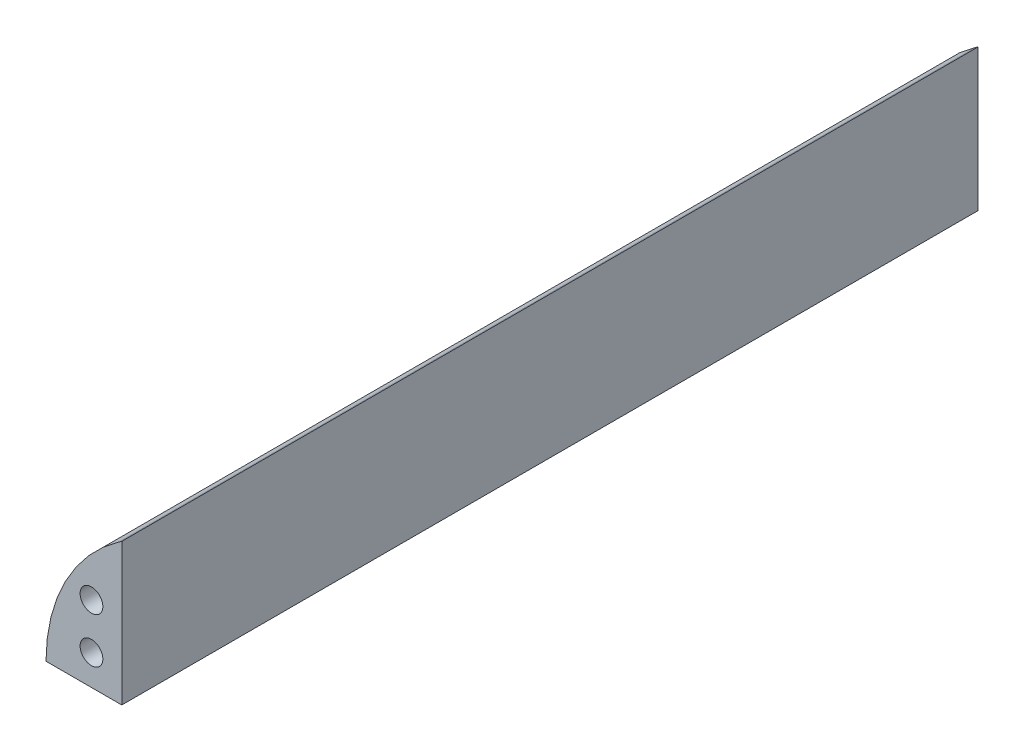
ISO-10303-21;
HEADER;
FILE_DESCRIPTION(('STEP AP214'),'2;1');
FILE_NAME('part.step','',(''),(''),'','','');
FILE_SCHEMA(('AUTOMOTIVE_DESIGN { 1 0 10303 214 1 1 1 1 }'));
ENDSEC;
DATA;
#1=APPLICATION_CONTEXT('core data for automotive mechanical design processes');
#2=APPLICATION_PROTOCOL_DEFINITION('international standard','automotive_design',2000,#1);
#3=PRODUCT_CONTEXT('',#1,'mechanical');
#4=PRODUCT('Part','Part','',(#3));
#5=PRODUCT_RELATED_PRODUCT_CATEGORY('part','',(#4));
#6=PRODUCT_DEFINITION_FORMATION('','',#4);
#7=PRODUCT_DEFINITION_CONTEXT('part definition',#1,'design');
#8=PRODUCT_DEFINITION('design','',#6,#7);
#9=PRODUCT_DEFINITION_SHAPE('','',#8);
#10=(LENGTH_UNIT() NAMED_UNIT(*) SI_UNIT(.MILLI.,.METRE.));
#11=(NAMED_UNIT(*) PLANE_ANGLE_UNIT() SI_UNIT($,.RADIAN.));
#12=(NAMED_UNIT(*) SI_UNIT($,.STERADIAN.) SOLID_ANGLE_UNIT());
#13=UNCERTAINTY_MEASURE_WITH_UNIT(LENGTH_MEASURE(1.E-05),#10,'distance_accuracy_value','');
#14=(GEOMETRIC_REPRESENTATION_CONTEXT(3) GLOBAL_UNCERTAINTY_ASSIGNED_CONTEXT((#13)) GLOBAL_UNIT_ASSIGNED_CONTEXT((#10,
#11,#12)) REPRESENTATION_CONTEXT('',''));
#15=CARTESIAN_POINT('',(0.,0.,0.));
#16=DIRECTION('',(0.,0.,1.));
#17=DIRECTION('',(1.,0.,0.));
#18=AXIS2_PLACEMENT_3D('',#15,#16,#17);
#19=CARTESIAN_POINT('',(11.5,30.9793370944993,113.));
#20=DIRECTION('',(0.,1.,0.));
#21=DIRECTION('',(-1.,0.,0.));
#22=AXIS2_PLACEMENT_3D('',#19,#20,#21);
#23=PLANE('',#22);
#24=DIRECTION('',(1.,0.,0.));
#25=VECTOR('',#24,1.);
#26=CARTESIAN_POINT('',(11.5,30.9793370944993,0.));
#27=LINE('',#26,#25);
#28=CARTESIAN_POINT('',(11.5,30.9793370944993,0.));
#29=VERTEX_POINT('',#28);
#30=CARTESIAN_POINT('',(21.5,30.9793370944993,0.));
#31=VERTEX_POINT('',#30);
#32=EDGE_CURVE('E149',#29,#31,#27,.T.);
#33=ORIENTED_EDGE('',*,*,#32,.T.);
#34=DIRECTION('',(0.,0.,-1.));
#35=VECTOR('',#34,1.);
#36=CARTESIAN_POINT('',(21.5,30.9793370944993,113.));
#37=LINE('',#36,#35);
#38=CARTESIAN_POINT('',(21.5,30.9793370944993,113.));
#39=VERTEX_POINT('',#38);
#40=EDGE_CURVE('E11',#39,#31,#37,.T.);
#41=ORIENTED_EDGE('',*,*,#40,.F.);
#42=DIRECTION('',(1.,0.,0.));
#43=VECTOR('',#42,1.);
#44=CARTESIAN_POINT('',(11.5,30.9793370944993,113.));
#45=LINE('',#44,#43);
#46=CARTESIAN_POINT('',(11.5,30.9793370944993,113.));
#47=VERTEX_POINT('',#46);
#48=EDGE_CURVE('E170',#47,#39,#45,.T.);
#49=ORIENTED_EDGE('',*,*,#48,.F.);
#50=DIRECTION('',(0.,0.,-1.));
#51=VECTOR('',#50,1.);
#52=CARTESIAN_POINT('',(11.5,30.9793370944993,113.));
#53=LINE('',#52,#51);
#54=EDGE_CURVE('E145',#47,#29,#53,.T.);
#55=ORIENTED_EDGE('',*,*,#54,.T.);
#56=EDGE_LOOP('',(#33,#41,#49,#55));
#57=FACE_BOUND('',#56,.T.);
#58=ADVANCED_FACE('F35',(#57),#23,.F.);
#59=CARTESIAN_POINT('',(21.5,30.9793370944993,113.));
#60=DIRECTION('',(-1.,0.,0.));
#61=DIRECTION('',(0.,0.,1.));
#62=AXIS2_PLACEMENT_3D('',#59,#60,#61);
#63=PLANE('',#62);
#64=DIRECTION('',(0.,1.,0.));
#65=VECTOR('',#64,1.);
#66=CARTESIAN_POINT('',(21.5,30.9793370944993,0.));
#67=LINE('',#66,#65);
#68=CARTESIAN_POINT('',(21.5,49.687624028369,0.));
#69=VERTEX_POINT('',#68);
#70=EDGE_CURVE('E152',#31,#69,#67,.T.);
#71=ORIENTED_EDGE('',*,*,#70,.T.);
#72=DIRECTION('',(0.,0.,-1.));
#73=VECTOR('',#72,1.);
#74=CARTESIAN_POINT('',(21.5,49.687624028369,113.));
#75=LINE('',#74,#73);
#76=CARTESIAN_POINT('',(21.5,49.687624028369,113.));
#77=VERTEX_POINT('',#76);
#78=EDGE_CURVE('E43',#77,#69,#75,.T.);
#79=ORIENTED_EDGE('',*,*,#78,.F.);
#80=DIRECTION('',(0.,1.,0.));
#81=VECTOR('',#80,1.);
#82=CARTESIAN_POINT('',(21.5,30.9793370944993,113.));
#83=LINE('',#82,#81);
#84=EDGE_CURVE('E103',#39,#77,#83,.T.);
#85=ORIENTED_EDGE('',*,*,#84,.F.);
#86=ORIENTED_EDGE('',*,*,#40,.T.);
#87=EDGE_LOOP('',(#71,#79,#85,#86));
#88=FACE_BOUND('',#87,.T.);
#89=ADVANCED_FACE('F243',(#88),#63,.F.);
#90=CARTESIAN_POINT('',(21.5,49.687624028369,113.));
#91=DIRECTION('',(0.56311095315379,-0.826381300876435,0.));
#92=DIRECTION('',(0.826381300876436,0.56311095315379,0.));
#93=AXIS2_PLACEMENT_3D('',#90,#91,#92);
#94=PLANE('',#93);
#95=DIRECTION('',(-0.826381300876435,-0.56311095315379,0.));
#96=VECTOR('',#95,1.);
#97=CARTESIAN_POINT('',(21.5,49.687624028369,0.));
#98=LINE('',#97,#96);
#99=CARTESIAN_POINT('',(21.1610596660596,49.456664041369,0.));
#100=VERTEX_POINT('',#99);
#101=EDGE_CURVE('E155',#69,#100,#98,.T.);
#102=ORIENTED_EDGE('',*,*,#101,.T.);
#103=DIRECTION('',(0.,0.,-1.));
#104=VECTOR('',#103,1.);
#105=CARTESIAN_POINT('',(21.1610596660596,49.456664041369,113.));
#106=LINE('',#105,#104);
#107=CARTESIAN_POINT('',(21.1610596660596,49.456664041369,113.));
#108=VERTEX_POINT('',#107);
#109=EDGE_CURVE('E186',#108,#100,#106,.T.);
#110=ORIENTED_EDGE('',*,*,#109,.F.);
#111=DIRECTION('',(-0.826381300876435,-0.56311095315379,0.));
#112=VECTOR('',#111,1.);
#113=CARTESIAN_POINT('',(21.5,49.687624028369,113.));
#114=LINE('',#113,#112);
#115=EDGE_CURVE('E194',#77,#108,#114,.T.);
#116=ORIENTED_EDGE('',*,*,#115,.F.);
#117=ORIENTED_EDGE('',*,*,#78,.T.);
#118=EDGE_LOOP('',(#102,#110,#116,#117));
#119=FACE_BOUND('',#118,.T.);
#120=ADVANCED_FACE('F192',(#119),#94,.F.);
#121=CARTESIAN_POINT('',(21.1610596660596,49.456664041369,113.));
#122=DIRECTION('',(0.618254008122195,-0.78597835939728,0.));
#123=DIRECTION('',(0.78597835939728,0.618254008122195,0.));
#124=AXIS2_PLACEMENT_3D('',#121,#122,#123);
#125=PLANE('',#124);
#126=DIRECTION('',(-0.78597835939728,-0.618254008122195,0.));
#127=VECTOR('',#126,1.);
#128=CARTESIAN_POINT('',(21.1610596660596,49.456664041369,0.));
#129=LINE('',#128,#127);
#130=CARTESIAN_POINT('',(19.0663453069363,47.8089525835215,0.));
#131=VERTEX_POINT('',#130);
#132=EDGE_CURVE('E157',#100,#131,#129,.T.);
#133=ORIENTED_EDGE('',*,*,#132,.T.);
#134=DIRECTION('',(0.,0.,-1.));
#135=VECTOR('',#134,1.);
#136=CARTESIAN_POINT('',(19.0663453069363,47.8089525835215,113.));
#137=LINE('',#136,#135);
#138=CARTESIAN_POINT('',(19.0663453069363,47.8089525835215,113.));
#139=VERTEX_POINT('',#138);
#140=EDGE_CURVE('E183',#139,#131,#137,.T.);
#141=ORIENTED_EDGE('',*,*,#140,.F.);
#142=DIRECTION('',(-0.78597835939728,-0.618254008122195,0.));
#143=VECTOR('',#142,1.);
#144=CARTESIAN_POINT('',(21.1610596660596,49.456664041369,113.));
#145=LINE('',#144,#143);
#146=EDGE_CURVE('E212',#108,#139,#145,.T.);
#147=ORIENTED_EDGE('',*,*,#146,.F.);
#148=ORIENTED_EDGE('',*,*,#109,.T.);
#149=EDGE_LOOP('',(#133,#141,#147,#148));
#150=FACE_BOUND('',#149,.T.);
#151=ADVANCED_FACE('F203',(#150),#125,.F.);
#152=CARTESIAN_POINT('',(19.0663453069363,47.8089525835215,113.));
#153=DIRECTION('',(0.707328887292362,-0.706884605294067,0.));
#154=DIRECTION('',(0.706884605294067,0.707328887292362,0.));
#155=AXIS2_PLACEMENT_3D('',#152,#153,#154);
#156=PLANE('',#155);
#157=DIRECTION('',(-0.706884605294067,-0.707328887292362,0.));
#158=VECTOR('',#157,1.);
#159=CARTESIAN_POINT('',(19.0663453069363,47.8089525835215,0.));
#160=LINE('',#159,#158);
#161=CARTESIAN_POINT('',(17.161004874362,45.902414630944,0.));
#162=VERTEX_POINT('',#161);
#163=EDGE_CURVE('E159',#131,#162,#160,.T.);
#164=ORIENTED_EDGE('',*,*,#163,.T.);
#165=DIRECTION('',(0.,0.,-1.));
#166=VECTOR('',#165,1.);
#167=CARTESIAN_POINT('',(17.161004874362,45.902414630944,113.));
#168=LINE('',#167,#166);
#169=CARTESIAN_POINT('',(17.161004874362,45.902414630944,113.));
#170=VERTEX_POINT('',#169);
#171=EDGE_CURVE('E180',#170,#162,#168,.T.);
#172=ORIENTED_EDGE('',*,*,#171,.F.);
#173=DIRECTION('',(-0.706884605294067,-0.707328887292362,0.));
#174=VECTOR('',#173,1.);
#175=CARTESIAN_POINT('',(19.0663453069363,47.8089525835215,113.));
#176=LINE('',#175,#174);
#177=EDGE_CURVE('E209',#139,#170,#176,.T.);
#178=ORIENTED_EDGE('',*,*,#177,.F.);
#179=ORIENTED_EDGE('',*,*,#140,.T.);
#180=EDGE_LOOP('',(#164,#172,#178,#179));
#181=FACE_BOUND('',#180,.T.);
#182=ADVANCED_FACE('F207',(#181),#156,.F.);
#183=CARTESIAN_POINT('',(17.161004874362,45.902414630944,113.));
#184=DIRECTION('',(0.787045273233736,-0.61689524060446,0.));
#185=DIRECTION('',(0.61689524060446,0.787045273233736,0.));
#186=AXIS2_PLACEMENT_3D('',#183,#184,#185);
#187=PLANE('',#186);
#188=DIRECTION('',(-0.61689524060446,-0.787045273233736,0.));
#189=VECTOR('',#188,1.);
#190=CARTESIAN_POINT('',(17.161004874362,45.902414630944,0.));
#191=LINE('',#190,#189);
#192=CARTESIAN_POINT('',(15.4864529995116,43.7659933212345,0.));
#193=VERTEX_POINT('',#192);
#194=EDGE_CURVE('E161',#162,#193,#191,.T.);
#195=ORIENTED_EDGE('',*,*,#194,.T.);
#196=DIRECTION('',(0.,0.,-1.));
#197=VECTOR('',#196,1.);
#198=CARTESIAN_POINT('',(15.4864529995116,43.7659933212345,113.));
#199=LINE('',#198,#197);
#200=CARTESIAN_POINT('',(15.4864529995116,43.7659933212345,113.));
#201=VERTEX_POINT('',#200);
#202=EDGE_CURVE('E177',#201,#193,#199,.T.);
#203=ORIENTED_EDGE('',*,*,#202,.F.);
#204=DIRECTION('',(-0.61689524060446,-0.787045273233736,0.));
#205=VECTOR('',#204,1.);
#206=CARTESIAN_POINT('',(17.161004874362,45.902414630944,113.));
#207=LINE('',#206,#205);
#208=EDGE_CURVE('E211',#170,#201,#207,.T.);
#209=ORIENTED_EDGE('',*,*,#208,.F.);
#210=ORIENTED_EDGE('',*,*,#171,.T.);
#211=EDGE_LOOP('',(#195,#203,#209,#210));
#212=FACE_BOUND('',#211,.T.);
#213=ADVANCED_FACE('F256',(#212),#187,.F.);
#214=CARTESIAN_POINT('',(15.4864529995116,43.7659933212345,113.));
#215=DIRECTION('',(0.855766354330929,-0.517362490711446,0.));
#216=DIRECTION('',(0.517362490711446,0.855766354330929,0.));
#217=AXIS2_PLACEMENT_3D('',#214,#215,#216);
#218=PLANE('',#217);
#219=DIRECTION('',(-0.517362490711446,-0.855766354330929,0.));
#220=VECTOR('',#219,1.);
#221=CARTESIAN_POINT('',(15.4864529995116,43.7659933212345,0.));
#222=LINE('',#221,#220);
#223=CARTESIAN_POINT('',(14.0749066390971,41.4311625120665,0.));
#224=VERTEX_POINT('',#223);
#225=EDGE_CURVE('E163',#193,#224,#222,.T.);
#226=ORIENTED_EDGE('',*,*,#225,.T.);
#227=DIRECTION('',(0.,0.,-1.));
#228=VECTOR('',#227,1.);
#229=CARTESIAN_POINT('',(14.0749066390971,41.4311625120665,113.));
#230=LINE('',#229,#228);
#231=CARTESIAN_POINT('',(14.0749066390971,41.4311625120665,113.));
#232=VERTEX_POINT('',#231);
#233=EDGE_CURVE('E174',#232,#224,#230,.T.);
#234=ORIENTED_EDGE('',*,*,#233,.F.);
#235=DIRECTION('',(-0.517362490711446,-0.855766354330929,0.));
#236=VECTOR('',#235,1.);
#237=CARTESIAN_POINT('',(15.4864529995116,43.7659933212345,113.));
#238=LINE('',#237,#236);
#239=EDGE_CURVE('E214',#201,#232,#238,.T.);
#240=ORIENTED_EDGE('',*,*,#239,.F.);
#241=ORIENTED_EDGE('',*,*,#202,.T.);
#242=EDGE_LOOP('',(#226,#234,#240,#241));
#243=FACE_BOUND('',#242,.T.);
#244=ADVANCED_FACE('F223',(#243),#218,.F.);
#245=CARTESIAN_POINT('',(14.0749066390971,41.4311625120665,113.));
#246=DIRECTION('',(0.911813208732102,-0.4106052512836,0.));
#247=DIRECTION('',(0.4106052512836,0.911813208732102,0.));
#248=AXIS2_PLACEMENT_3D('',#245,#246,#247);
#249=PLANE('',#248);
#250=DIRECTION('',(-0.410605251283599,-0.911813208732102,0.));
#251=VECTOR('',#250,1.);
#252=CARTESIAN_POINT('',(14.0749066390971,41.4311625120665,0.));
#253=LINE('',#252,#251);
#254=CARTESIAN_POINT('',(12.967287062268,38.9715199301808,0.));
#255=VERTEX_POINT('',#254);
#256=EDGE_CURVE('E165',#224,#255,#253,.T.);
#257=ORIENTED_EDGE('',*,*,#256,.T.);
#258=DIRECTION('',(0.,0.,-1.));
#259=VECTOR('',#258,1.);
#260=CARTESIAN_POINT('',(12.967287062268,38.9715199301808,113.));
#261=LINE('',#260,#259);
#262=CARTESIAN_POINT('',(12.967287062268,38.9715199301808,113.));
#263=VERTEX_POINT('',#262);
#264=EDGE_CURVE('E140',#263,#255,#261,.T.);
#265=ORIENTED_EDGE('',*,*,#264,.F.);
#266=DIRECTION('',(-0.410605251283599,-0.911813208732102,0.));
#267=VECTOR('',#266,1.);
#268=CARTESIAN_POINT('',(14.0749066390971,41.4311625120665,113.));
#269=LINE('',#268,#267);
#270=EDGE_CURVE('E131',#232,#263,#269,.T.);
#271=ORIENTED_EDGE('',*,*,#270,.F.);
#272=ORIENTED_EDGE('',*,*,#233,.T.);
#273=EDGE_LOOP('',(#257,#265,#271,#272));
#274=FACE_BOUND('',#273,.T.);
#275=ADVANCED_FACE('F227',(#274),#249,.F.);
#276=CARTESIAN_POINT('',(12.967287062268,38.9715199301808,113.));
#277=DIRECTION('',(0.954564874636339,-0.29800318808783,0.));
#278=DIRECTION('',(0.29800318808783,0.954564874636339,0.));
#279=AXIS2_PLACEMENT_3D('',#276,#277,#278);
#280=PLANE('',#279);
#281=DIRECTION('',(-0.29800318808783,-0.954564874636339,0.));
#282=VECTOR('',#281,1.);
#283=CARTESIAN_POINT('',(12.967287062268,38.9715199301808,0.));
#284=LINE('',#283,#282);
#285=CARTESIAN_POINT('',(12.1559784505216,36.3727332922512,0.));
#286=VERTEX_POINT('',#285);
#287=EDGE_CURVE('E139',#255,#286,#284,.T.);
#288=ORIENTED_EDGE('',*,*,#287,.T.);
#289=DIRECTION('',(0.,0.,-1.));
#290=VECTOR('',#289,1.);
#291=CARTESIAN_POINT('',(12.1559784505216,36.3727332922512,113.));
#292=LINE('',#291,#290);
#293=CARTESIAN_POINT('',(12.1559784505216,36.3727332922512,113.));
#294=VERTEX_POINT('',#293);
#295=EDGE_CURVE('E136',#294,#286,#292,.T.);
#296=ORIENTED_EDGE('',*,*,#295,.F.);
#297=DIRECTION('',(-0.29800318808783,-0.954564874636339,0.));
#298=VECTOR('',#297,1.);
#299=CARTESIAN_POINT('',(12.967287062268,38.9715199301808,113.));
#300=LINE('',#299,#298);
#301=EDGE_CURVE('E125',#263,#294,#300,.T.);
#302=ORIENTED_EDGE('',*,*,#301,.F.);
#303=ORIENTED_EDGE('',*,*,#264,.T.);
#304=EDGE_LOOP('',(#288,#296,#302,#303));
#305=FACE_BOUND('',#304,.T.);
#306=ADVANCED_FACE('F137',(#305),#280,.F.);
#307=CARTESIAN_POINT('',(12.1559784505216,36.3727332922512,113.));
#308=DIRECTION('',(0.983707611874339,-0.179775789083194,0.));
#309=DIRECTION('',(0.179775789083194,0.983707611874339,0.));
#310=AXIS2_PLACEMENT_3D('',#307,#308,#309);
#311=PLANE('',#310);
#312=DIRECTION('',(-0.179775789083194,-0.983707611874339,0.));
#313=VECTOR('',#312,1.);
#314=CARTESIAN_POINT('',(12.1559784505216,36.3727332922512,0.));
#315=LINE('',#314,#313);
#316=CARTESIAN_POINT('',(11.6603370736296,33.6606539978424,0.));
#317=VERTEX_POINT('',#316);
#318=EDGE_CURVE('E89',#286,#317,#315,.T.);
#319=ORIENTED_EDGE('',*,*,#318,.T.);
#320=DIRECTION('',(0.,0.,-1.));
#321=VECTOR('',#320,1.);
#322=CARTESIAN_POINT('',(11.6603370736296,33.6606539978424,113.));
#323=LINE('',#322,#321);
#324=CARTESIAN_POINT('',(11.6603370736296,33.6606539978424,113.));
#325=VERTEX_POINT('',#324);
#326=EDGE_CURVE('E141',#325,#317,#323,.T.);
#327=ORIENTED_EDGE('',*,*,#326,.F.);
#328=DIRECTION('',(-0.179775789083194,-0.983707611874339,0.));
#329=VECTOR('',#328,1.);
#330=CARTESIAN_POINT('',(12.1559784505216,36.3727332922512,113.));
#331=LINE('',#330,#329);
#332=EDGE_CURVE('E129',#294,#325,#331,.T.);
#333=ORIENTED_EDGE('',*,*,#332,.F.);
#334=ORIENTED_EDGE('',*,*,#295,.T.);
#335=EDGE_LOOP('',(#319,#327,#333,#334));
#336=FACE_BOUND('',#335,.T.);
#337=ADVANCED_FACE('F143',(#336),#311,.F.);
#338=CARTESIAN_POINT('',(11.6603370736296,33.6606539978424,113.));
#339=DIRECTION('',(0.998216887214067,-0.0596912563166381,0.));
#340=DIRECTION('',(0.0596912563166381,0.998216887214067,0.));
#341=AXIS2_PLACEMENT_3D('',#338,#339,#340);
#342=PLANE('',#341);
#343=DIRECTION('',(-0.0596912563166381,-0.998216887214067,0.));
#344=VECTOR('',#343,1.);
#345=CARTESIAN_POINT('',(11.6603370736296,33.6606539978424,0.));
#346=LINE('',#345,#344);
#347=EDGE_CURVE('E95',#317,#29,#346,.T.);
#348=ORIENTED_EDGE('',*,*,#347,.T.);
#349=ORIENTED_EDGE('',*,*,#54,.F.);
#350=DIRECTION('',(-0.0596912563166381,-0.998216887214067,0.));
#351=VECTOR('',#350,1.);
#352=CARTESIAN_POINT('',(11.6603370736296,33.6606539978424,113.));
#353=LINE('',#352,#351);
#354=EDGE_CURVE('E51',#325,#47,#353,.T.);
#355=ORIENTED_EDGE('',*,*,#354,.F.);
#356=ORIENTED_EDGE('',*,*,#326,.T.);
#357=EDGE_LOOP('',(#348,#349,#355,#356));
#358=FACE_BOUND('',#357,.T.);
#359=ADVANCED_FACE('F231',(#358),#342,.F.);
#360=CARTESIAN_POINT('',(0.,0.,113.));
#361=DIRECTION('',(0.,0.,1.));
#362=DIRECTION('',(1.,0.,0.));
#363=AXIS2_PLACEMENT_3D('',#360,#361,#362);
#364=PLANE('',#363);
#365=CARTESIAN_POINT('',(17.5,40.9793370944993,113.));
#366=DIRECTION('',(0.,0.,1.));
#367=DIRECTION('',(1.,0.,0.));
#368=AXIS2_PLACEMENT_3D('',#365,#366,#367);
#369=CIRCLE('',#368,1.5);
#370=CARTESIAN_POINT('',(19.,40.9793370944993,113.));
#371=VERTEX_POINT('',#370);
#372=EDGE_CURVE('E321',#371,#371,#369,.T.);
#373=ORIENTED_EDGE('',*,*,#372,.F.);
#374=EDGE_LOOP('',(#373));
#375=FACE_BOUND('',#374,.T.);
#376=CARTESIAN_POINT('',(17.5,34.9793370944993,113.));
#377=DIRECTION('',(0.,0.,1.));
#378=DIRECTION('',(1.,0.,0.));
#379=AXIS2_PLACEMENT_3D('',#376,#377,#378);
#380=CIRCLE('',#379,1.5);
#381=CARTESIAN_POINT('',(19.,34.9793370944993,113.));
#382=VERTEX_POINT('',#381);
#383=EDGE_CURVE('E323',#382,#382,#380,.T.);
#384=ORIENTED_EDGE('',*,*,#383,.F.);
#385=EDGE_LOOP('',(#384));
#386=FACE_BOUND('',#385,.T.);
#387=ORIENTED_EDGE('',*,*,#48,.T.);
#388=ORIENTED_EDGE('',*,*,#84,.T.);
#389=ORIENTED_EDGE('',*,*,#115,.T.);
#390=ORIENTED_EDGE('',*,*,#146,.T.);
#391=ORIENTED_EDGE('',*,*,#177,.T.);
#392=ORIENTED_EDGE('',*,*,#208,.T.);
#393=ORIENTED_EDGE('',*,*,#239,.T.);
#394=ORIENTED_EDGE('',*,*,#270,.T.);
#395=ORIENTED_EDGE('',*,*,#301,.T.);
#396=ORIENTED_EDGE('',*,*,#332,.T.);
#397=ORIENTED_EDGE('',*,*,#354,.T.);
#398=EDGE_LOOP('',(#387,#388,#389,#390,#391,#392,#393,#394,#395,#396,#397));
#399=FACE_BOUND('',#398,.T.);
#400=ADVANCED_FACE('F127',(#375,#386,#399),#364,.T.);
#401=CARTESIAN_POINT('',(0.,0.,0.));
#402=DIRECTION('',(0.,0.,1.));
#403=DIRECTION('',(1.,0.,0.));
#404=AXIS2_PLACEMENT_3D('',#401,#402,#403);
#405=PLANE('',#404);
#406=CARTESIAN_POINT('',(17.5,40.9793370944993,0.));
#407=DIRECTION('',(0.,0.,1.));
#408=DIRECTION('',(1.,0.,0.));
#409=AXIS2_PLACEMENT_3D('',#406,#407,#408);
#410=CIRCLE('',#409,1.5);
#411=CARTESIAN_POINT('',(19.,40.9793370944993,0.));
#412=VERTEX_POINT('',#411);
#413=EDGE_CURVE('E318',#412,#412,#410,.T.);
#414=ORIENTED_EDGE('',*,*,#413,.T.);
#415=EDGE_LOOP('',(#414));
#416=FACE_BOUND('',#415,.T.);
#417=CARTESIAN_POINT('',(17.5,34.9793370944993,0.));
#418=DIRECTION('',(0.,0.,1.));
#419=DIRECTION('',(1.,0.,0.));
#420=AXIS2_PLACEMENT_3D('',#417,#418,#419);
#421=CIRCLE('',#420,1.5);
#422=CARTESIAN_POINT('',(19.,34.9793370944993,0.));
#423=VERTEX_POINT('',#422);
#424=EDGE_CURVE('E153',#423,#423,#421,.T.);
#425=ORIENTED_EDGE('',*,*,#424,.T.);
#426=EDGE_LOOP('',(#425));
#427=FACE_BOUND('',#426,.T.);
#428=ORIENTED_EDGE('',*,*,#32,.F.);
#429=ORIENTED_EDGE('',*,*,#347,.F.);
#430=ORIENTED_EDGE('',*,*,#318,.F.);
#431=ORIENTED_EDGE('',*,*,#287,.F.);
#432=ORIENTED_EDGE('',*,*,#256,.F.);
#433=ORIENTED_EDGE('',*,*,#225,.F.);
#434=ORIENTED_EDGE('',*,*,#194,.F.);
#435=ORIENTED_EDGE('',*,*,#163,.F.);
#436=ORIENTED_EDGE('',*,*,#132,.F.);
#437=ORIENTED_EDGE('',*,*,#101,.F.);
#438=ORIENTED_EDGE('',*,*,#70,.F.);
#439=EDGE_LOOP('',(#428,#429,#430,#431,#432,#433,#434,#435,#436,#437,#438));
#440=FACE_BOUND('',#439,.T.);
#441=ADVANCED_FACE('F198',(#416,#427,#440),#405,.F.);
#442=CARTESIAN_POINT('',(17.5,34.9793370944993,0.));
#443=DIRECTION('',(0.,0.,1.));
#444=DIRECTION('',(1.,0.,0.));
#445=AXIS2_PLACEMENT_3D('',#442,#443,#444);
#446=CYLINDRICAL_SURFACE('',#445,1.5);
#447=ORIENTED_EDGE('',*,*,#424,.F.);
#448=EDGE_LOOP('',(#447));
#449=FACE_BOUND('',#448,.T.);
#450=ORIENTED_EDGE('',*,*,#383,.T.);
#451=EDGE_LOOP('',(#450));
#452=FACE_BOUND('',#451,.T.);
#453=ADVANCED_FACE('F292',(#449,#452),#446,.F.);
#454=CARTESIAN_POINT('',(17.5,40.9793370944993,0.));
#455=DIRECTION('',(0.,0.,1.));
#456=DIRECTION('',(1.,0.,0.));
#457=AXIS2_PLACEMENT_3D('',#454,#455,#456);
#458=CYLINDRICAL_SURFACE('',#457,1.5);
#459=ORIENTED_EDGE('',*,*,#413,.F.);
#460=EDGE_LOOP('',(#459));
#461=FACE_BOUND('',#460,.T.);
#462=ORIENTED_EDGE('',*,*,#372,.T.);
#463=EDGE_LOOP('',(#462));
#464=FACE_BOUND('',#463,.T.);
#465=ADVANCED_FACE('F301',(#461,#464),#458,.F.);
#466=CLOSED_SHELL('',(#58,#89,#120,#151,#182,#213,#244,#275,#306,#337,#359,#400,#441,#453,#465));
#467=MANIFOLD_SOLID_BREP('B2',#466);
#468=ADVANCED_BREP_SHAPE_REPRESENTATION('',(#18,#467),#14);
#469=SHAPE_DEFINITION_REPRESENTATION(#9,#468);
ENDSEC;
END-ISO-10303-21;
